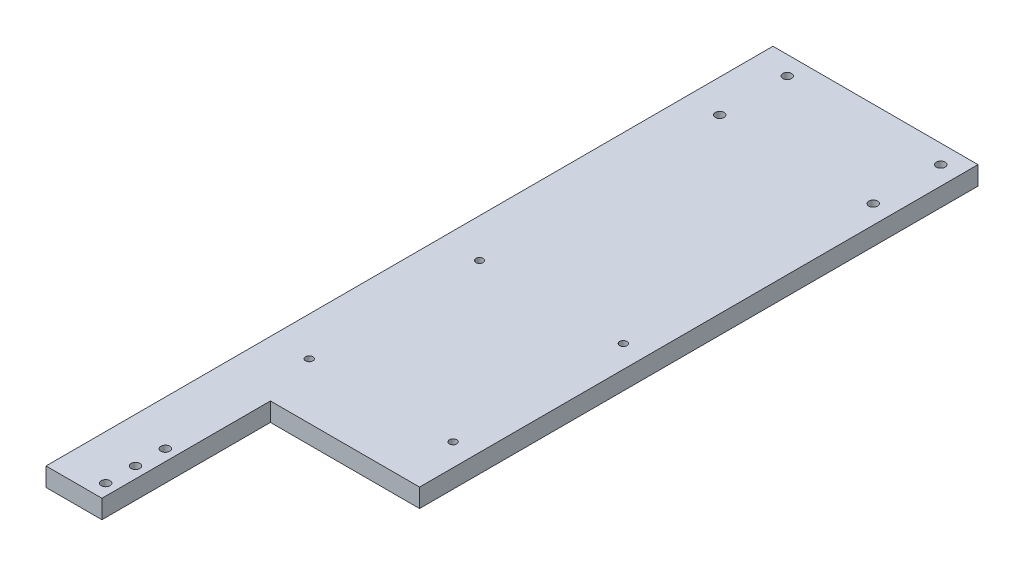
ISO-10303-21;
HEADER;
FILE_DESCRIPTION(('STEP AP214'),'2;1');
FILE_NAME('part.step','',(''),(''),'','','');
FILE_SCHEMA(('AUTOMOTIVE_DESIGN { 1 0 10303 214 1 1 1 1 }'));
ENDSEC;
DATA;
#1=APPLICATION_CONTEXT('core data for automotive mechanical design processes');
#2=APPLICATION_PROTOCOL_DEFINITION('international standard','automotive_design',2000,#1);
#3=PRODUCT_CONTEXT('',#1,'mechanical');
#4=PRODUCT('Part','Part','',(#3));
#5=PRODUCT_RELATED_PRODUCT_CATEGORY('part','',(#4));
#6=PRODUCT_DEFINITION_FORMATION('','',#4);
#7=PRODUCT_DEFINITION_CONTEXT('part definition',#1,'design');
#8=PRODUCT_DEFINITION('design','',#6,#7);
#9=PRODUCT_DEFINITION_SHAPE('','',#8);
#10=(LENGTH_UNIT() NAMED_UNIT(*) SI_UNIT(.MILLI.,.METRE.));
#11=(NAMED_UNIT(*) PLANE_ANGLE_UNIT() SI_UNIT($,.RADIAN.));
#12=(NAMED_UNIT(*) SI_UNIT($,.STERADIAN.) SOLID_ANGLE_UNIT());
#13=UNCERTAINTY_MEASURE_WITH_UNIT(LENGTH_MEASURE(1.E-05),#10,'distance_accuracy_value','');
#14=(GEOMETRIC_REPRESENTATION_CONTEXT(3) GLOBAL_UNCERTAINTY_ASSIGNED_CONTEXT((#13)) GLOBAL_UNIT_ASSIGNED_CONTEXT((#10,
#11,#12)) REPRESENTATION_CONTEXT('',''));
#15=CARTESIAN_POINT('',(0.,0.,0.));
#16=DIRECTION('',(0.,0.,1.));
#17=DIRECTION('',(1.,0.,0.));
#18=AXIS2_PLACEMENT_3D('',#15,#16,#17);
#19=CARTESIAN_POINT('',(0.,6.35,0.));
#20=DIRECTION('',(1.,0.,0.));
#21=DIRECTION('',(0.,0.,-1.));
#22=AXIS2_PLACEMENT_3D('',#19,#20,#21);
#23=PLANE('',#22);
#24=DIRECTION('',(0.,0.,1.));
#25=VECTOR('',#24,1.);
#26=CARTESIAN_POINT('',(0.,0.,0.));
#27=LINE('',#26,#25);
#28=CARTESIAN_POINT('',(0.,0.,-247.65));
#29=VERTEX_POINT('',#28);
#30=CARTESIAN_POINT('',(0.,0.,0.));
#31=VERTEX_POINT('',#30);
#32=EDGE_CURVE('E131',#29,#31,#27,.T.);
#33=ORIENTED_EDGE('',*,*,#32,.T.);
#34=DIRECTION('',(0.,-1.,0.));
#35=VECTOR('',#34,1.);
#36=CARTESIAN_POINT('',(0.,6.35,0.));
#37=LINE('',#36,#35);
#38=CARTESIAN_POINT('',(0.,6.35,0.));
#39=VERTEX_POINT('',#38);
#40=EDGE_CURVE('E11',#39,#31,#37,.T.);
#41=ORIENTED_EDGE('',*,*,#40,.F.);
#42=DIRECTION('',(0.,0.,1.));
#43=VECTOR('',#42,1.);
#44=CARTESIAN_POINT('',(0.,6.35,0.));
#45=LINE('',#44,#43);
#46=CARTESIAN_POINT('',(0.,6.35,-247.65));
#47=VERTEX_POINT('',#46);
#48=EDGE_CURVE('E128',#47,#39,#45,.T.);
#49=ORIENTED_EDGE('',*,*,#48,.F.);
#50=DIRECTION('',(0.,-1.,0.));
#51=VECTOR('',#50,1.);
#52=CARTESIAN_POINT('',(0.,6.35,-247.65));
#53=LINE('',#52,#51);
#54=EDGE_CURVE('E135',#47,#29,#53,.T.);
#55=ORIENTED_EDGE('',*,*,#54,.T.);
#56=EDGE_LOOP('',(#33,#41,#49,#55));
#57=FACE_BOUND('',#56,.T.);
#58=ADVANCED_FACE('F39',(#57),#23,.F.);
#59=CARTESIAN_POINT('',(0.,6.35,0.));
#60=DIRECTION('',(0.,0.,-1.));
#61=DIRECTION('',(-1.,0.,0.));
#62=AXIS2_PLACEMENT_3D('',#59,#60,#61);
#63=PLANE('',#62);
#64=DIRECTION('',(1.,0.,0.));
#65=VECTOR('',#64,1.);
#66=CARTESIAN_POINT('',(0.,0.,0.));
#67=LINE('',#66,#65);
#68=CARTESIAN_POINT('',(19.05,0.,0.));
#69=VERTEX_POINT('',#68);
#70=EDGE_CURVE('E124',#31,#69,#67,.T.);
#71=ORIENTED_EDGE('',*,*,#70,.T.);
#72=DIRECTION('',(0.,1.,0.));
#73=VECTOR('',#72,1.);
#74=CARTESIAN_POINT('',(19.05,0.,0.));
#75=LINE('',#74,#73);
#76=CARTESIAN_POINT('',(19.05,6.35,0.));
#77=VERTEX_POINT('',#76);
#78=EDGE_CURVE('E147',#69,#77,#75,.T.);
#79=ORIENTED_EDGE('',*,*,#78,.T.);
#80=DIRECTION('',(1.,0.,0.));
#81=VECTOR('',#80,1.);
#82=CARTESIAN_POINT('',(0.,6.35,0.));
#83=LINE('',#82,#81);
#84=EDGE_CURVE('E86',#39,#77,#83,.T.);
#85=ORIENTED_EDGE('',*,*,#84,.F.);
#86=ORIENTED_EDGE('',*,*,#40,.T.);
#87=EDGE_LOOP('',(#71,#79,#85,#86));
#88=FACE_BOUND('',#87,.T.);
#89=ADVANCED_FACE('F161',(#88),#63,.F.);
#90=CARTESIAN_POINT('',(69.85,6.35,0.));
#91=DIRECTION('',(-1.,0.,0.));
#92=DIRECTION('',(0.,0.,1.));
#93=AXIS2_PLACEMENT_3D('',#90,#91,#92);
#94=PLANE('',#93);
#95=DIRECTION('',(0.,0.,-1.));
#96=VECTOR('',#95,1.);
#97=CARTESIAN_POINT('',(69.85,6.35,0.));
#98=LINE('',#97,#96);
#99=CARTESIAN_POINT('',(69.85,6.35,-57.404));
#100=VERTEX_POINT('',#99);
#101=CARTESIAN_POINT('',(69.85,6.35,-247.65));
#102=VERTEX_POINT('',#101);
#103=EDGE_CURVE('E118',#100,#102,#98,.T.);
#104=ORIENTED_EDGE('',*,*,#103,.F.);
#105=DIRECTION('',(0.,1.,0.));
#106=VECTOR('',#105,1.);
#107=CARTESIAN_POINT('',(69.85,0.,-57.404));
#108=LINE('',#107,#106);
#109=CARTESIAN_POINT('',(69.85,0.,-57.404));
#110=VERTEX_POINT('',#109);
#111=EDGE_CURVE('E105',#110,#100,#108,.T.);
#112=ORIENTED_EDGE('',*,*,#111,.F.);
#113=DIRECTION('',(0.,0.,-1.));
#114=VECTOR('',#113,1.);
#115=CARTESIAN_POINT('',(69.85,0.,0.));
#116=LINE('',#115,#114);
#117=CARTESIAN_POINT('',(69.85,0.,-247.65));
#118=VERTEX_POINT('',#117);
#119=EDGE_CURVE('E117',#110,#118,#116,.T.);
#120=ORIENTED_EDGE('',*,*,#119,.T.);
#121=DIRECTION('',(0.,-1.,0.));
#122=VECTOR('',#121,1.);
#123=CARTESIAN_POINT('',(69.85,6.35,-247.65));
#124=LINE('',#123,#122);
#125=EDGE_CURVE('E47',#102,#118,#124,.T.);
#126=ORIENTED_EDGE('',*,*,#125,.F.);
#127=EDGE_LOOP('',(#104,#112,#120,#126));
#128=FACE_BOUND('',#127,.T.);
#129=ADVANCED_FACE('F115',(#128),#94,.F.);
#130=CARTESIAN_POINT('',(0.,6.35,-247.65));
#131=DIRECTION('',(0.,0.,1.));
#132=DIRECTION('',(1.,0.,0.));
#133=AXIS2_PLACEMENT_3D('',#130,#131,#132);
#134=PLANE('',#133);
#135=DIRECTION('',(-1.,0.,0.));
#136=VECTOR('',#135,1.);
#137=CARTESIAN_POINT('',(0.,0.,-247.65));
#138=LINE('',#137,#136);
#139=EDGE_CURVE('E80',#118,#29,#138,.T.);
#140=ORIENTED_EDGE('',*,*,#139,.T.);
#141=ORIENTED_EDGE('',*,*,#54,.F.);
#142=DIRECTION('',(-1.,0.,0.));
#143=VECTOR('',#142,1.);
#144=CARTESIAN_POINT('',(0.,6.35,-247.65));
#145=LINE('',#144,#143);
#146=EDGE_CURVE('E63',#102,#47,#145,.T.);
#147=ORIENTED_EDGE('',*,*,#146,.F.);
#148=ORIENTED_EDGE('',*,*,#125,.T.);
#149=EDGE_LOOP('',(#140,#141,#147,#148));
#150=FACE_BOUND('',#149,.T.);
#151=ADVANCED_FACE('F138',(#150),#134,.F.);
#152=CARTESIAN_POINT('',(0.,6.35,0.));
#153=DIRECTION('',(0.,-1.,0.));
#154=DIRECTION('',(0.,0.,-1.));
#155=AXIS2_PLACEMENT_3D('',#152,#153,#154);
#156=PLANE('',#155);
#157=CARTESIAN_POINT('',(13.23,6.35,-134.454));
#158=DIRECTION('',(0.,1.,0.));
#159=DIRECTION('',(0.,0.,1.));
#160=AXIS2_PLACEMENT_3D('',#157,#158,#159);
#161=CIRCLE('',#160,1.25);
#162=CARTESIAN_POINT('',(13.23,6.35,-133.204));
#163=VERTEX_POINT('',#162);
#164=EDGE_CURVE('E248',#163,#163,#161,.T.);
#165=ORIENTED_EDGE('',*,*,#164,.F.);
#166=EDGE_LOOP('',(#165));
#167=FACE_BOUND('',#166,.T.);
#168=CARTESIAN_POINT('',(62.23,6.35,-76.454));
#169=DIRECTION('',(0.,1.,0.));
#170=DIRECTION('',(0.,0.,1.));
#171=AXIS2_PLACEMENT_3D('',#168,#169,#170);
#172=CIRCLE('',#171,1.24999999999999);
#173=CARTESIAN_POINT('',(62.23,6.35,-75.204));
#174=VERTEX_POINT('',#173);
#175=EDGE_CURVE('E239',#174,#174,#172,.T.);
#176=ORIENTED_EDGE('',*,*,#175,.F.);
#177=EDGE_LOOP('',(#176));
#178=FACE_BOUND('',#177,.T.);
#179=CARTESIAN_POINT('',(13.23,6.35,-76.454));
#180=DIRECTION('',(0.,1.,0.));
#181=DIRECTION('',(0.,0.,1.));
#182=AXIS2_PLACEMENT_3D('',#179,#180,#181);
#183=CIRCLE('',#182,1.25);
#184=CARTESIAN_POINT('',(13.23,6.35,-75.204));
#185=VERTEX_POINT('',#184);
#186=EDGE_CURVE('E255',#185,#185,#183,.T.);
#187=ORIENTED_EDGE('',*,*,#186,.F.);
#188=EDGE_LOOP('',(#187));
#189=FACE_BOUND('',#188,.T.);
#190=CARTESIAN_POINT('',(62.23,6.35,-134.454));
#191=DIRECTION('',(0.,1.,0.));
#192=DIRECTION('',(0.,0.,1.));
#193=AXIS2_PLACEMENT_3D('',#190,#191,#192);
#194=CIRCLE('',#193,1.24999999999999);
#195=CARTESIAN_POINT('',(62.23,6.35,-133.204));
#196=VERTEX_POINT('',#195);
#197=EDGE_CURVE('E231',#196,#196,#194,.T.);
#198=ORIENTED_EDGE('',*,*,#197,.F.);
#199=EDGE_LOOP('',(#198));
#200=FACE_BOUND('',#199,.T.);
#201=CARTESIAN_POINT('',(11.2,6.35,-241.3));
#202=DIRECTION('',(0.,1.,0.));
#203=DIRECTION('',(0.,0.,1.));
#204=AXIS2_PLACEMENT_3D('',#201,#202,#203);
#205=CIRCLE('',#204,1.5);
#206=CARTESIAN_POINT('',(11.2,6.35,-239.8));
#207=VERTEX_POINT('',#206);
#208=EDGE_CURVE('E207',#207,#207,#205,.T.);
#209=ORIENTED_EDGE('',*,*,#208,.F.);
#210=EDGE_LOOP('',(#209));
#211=FACE_BOUND('',#210,.T.);
#212=CARTESIAN_POINT('',(11.2,6.35,-218.3));
#213=DIRECTION('',(0.,1.,0.));
#214=DIRECTION('',(0.,0.,1.));
#215=AXIS2_PLACEMENT_3D('',#212,#213,#214);
#216=CIRCLE('',#215,1.5);
#217=CARTESIAN_POINT('',(11.2,6.35,-216.8));
#218=VERTEX_POINT('',#217);
#219=EDGE_CURVE('E216',#218,#218,#216,.T.);
#220=ORIENTED_EDGE('',*,*,#219,.F.);
#221=EDGE_LOOP('',(#220));
#222=FACE_BOUND('',#221,.T.);
#223=CARTESIAN_POINT('',(63.5,6.35,-218.3));
#224=DIRECTION('',(0.,1.,0.));
#225=DIRECTION('',(0.,0.,1.));
#226=AXIS2_PLACEMENT_3D('',#223,#224,#225);
#227=CIRCLE('',#226,1.5);
#228=CARTESIAN_POINT('',(63.5,6.35,-216.8));
#229=VERTEX_POINT('',#228);
#230=EDGE_CURVE('E224',#229,#229,#227,.T.);
#231=ORIENTED_EDGE('',*,*,#230,.F.);
#232=EDGE_LOOP('',(#231));
#233=FACE_BOUND('',#232,.T.);
#234=CARTESIAN_POINT('',(63.5,6.35,-241.3));
#235=DIRECTION('',(0.,1.,0.));
#236=DIRECTION('',(0.,0.,1.));
#237=AXIS2_PLACEMENT_3D('',#234,#235,#236);
#238=CIRCLE('',#237,1.5);
#239=CARTESIAN_POINT('',(63.5,6.35,-239.8));
#240=VERTEX_POINT('',#239);
#241=EDGE_CURVE('E180',#240,#240,#238,.T.);
#242=ORIENTED_EDGE('',*,*,#241,.F.);
#243=EDGE_LOOP('',(#242));
#244=FACE_BOUND('',#243,.T.);
#245=CARTESIAN_POINT('',(15.24,6.35,-5.08));
#246=DIRECTION('',(0.,1.,0.));
#247=DIRECTION('',(0.,0.,1.));
#248=AXIS2_PLACEMENT_3D('',#245,#246,#247);
#249=CIRCLE('',#248,1.5);
#250=CARTESIAN_POINT('',(15.24,6.35,-3.58));
#251=VERTEX_POINT('',#250);
#252=EDGE_CURVE('E171',#251,#251,#249,.T.);
#253=ORIENTED_EDGE('',*,*,#252,.F.);
#254=EDGE_LOOP('',(#253));
#255=FACE_BOUND('',#254,.T.);
#256=CARTESIAN_POINT('',(15.24,6.35,-25.4));
#257=DIRECTION('',(0.,1.,0.));
#258=DIRECTION('',(0.,0.,1.));
#259=AXIS2_PLACEMENT_3D('',#256,#257,#258);
#260=CIRCLE('',#259,1.5);
#261=CARTESIAN_POINT('',(15.24,6.35,-23.9));
#262=VERTEX_POINT('',#261);
#263=EDGE_CURVE('E186',#262,#262,#260,.T.);
#264=ORIENTED_EDGE('',*,*,#263,.F.);
#265=EDGE_LOOP('',(#264));
#266=FACE_BOUND('',#265,.T.);
#267=CARTESIAN_POINT('',(15.24,6.35,-15.24));
#268=DIRECTION('',(0.,1.,0.));
#269=DIRECTION('',(0.,0.,1.));
#270=AXIS2_PLACEMENT_3D('',#267,#268,#269);
#271=CIRCLE('',#270,1.5);
#272=CARTESIAN_POINT('',(15.24,6.35,-13.74));
#273=VERTEX_POINT('',#272);
#274=EDGE_CURVE('E193',#273,#273,#271,.T.);
#275=ORIENTED_EDGE('',*,*,#274,.F.);
#276=EDGE_LOOP('',(#275));
#277=FACE_BOUND('',#276,.T.);
#278=ORIENTED_EDGE('',*,*,#84,.T.);
#279=DIRECTION('',(0.,0.,1.));
#280=VECTOR('',#279,1.);
#281=CARTESIAN_POINT('',(19.05,6.35,0.));
#282=LINE('',#281,#280);
#283=CARTESIAN_POINT('',(19.05,6.35,-57.404));
#284=VERTEX_POINT('',#283);
#285=EDGE_CURVE('E111',#284,#77,#282,.T.);
#286=ORIENTED_EDGE('',*,*,#285,.F.);
#287=DIRECTION('',(-1.,0.,0.));
#288=VECTOR('',#287,1.);
#289=CARTESIAN_POINT('',(69.85,6.35,-57.404));
#290=LINE('',#289,#288);
#291=EDGE_CURVE('E165',#100,#284,#290,.T.);
#292=ORIENTED_EDGE('',*,*,#291,.F.);
#293=ORIENTED_EDGE('',*,*,#103,.T.);
#294=ORIENTED_EDGE('',*,*,#146,.T.);
#295=ORIENTED_EDGE('',*,*,#48,.T.);
#296=EDGE_LOOP('',(#278,#286,#292,#293,#294,#295));
#297=FACE_BOUND('',#296,.T.);
#298=ADVANCED_FACE('F160',(#167,#178,#189,#200,#211,#222,#233,#244,#255,#266,#277,#297),#156,.F.);
#299=CARTESIAN_POINT('',(0.,0.,0.));
#300=DIRECTION('',(0.,-1.,0.));
#301=DIRECTION('',(0.,0.,-1.));
#302=AXIS2_PLACEMENT_3D('',#299,#300,#301);
#303=PLANE('',#302);
#304=CARTESIAN_POINT('',(13.23,0.,-134.454));
#305=DIRECTION('',(0.,1.,0.));
#306=DIRECTION('',(0.,0.,1.));
#307=AXIS2_PLACEMENT_3D('',#304,#305,#306);
#308=CIRCLE('',#307,1.25);
#309=CARTESIAN_POINT('',(13.23,0.,-133.204));
#310=VERTEX_POINT('',#309);
#311=EDGE_CURVE('E235',#310,#310,#308,.T.);
#312=ORIENTED_EDGE('',*,*,#311,.T.);
#313=EDGE_LOOP('',(#312));
#314=FACE_BOUND('',#313,.T.);
#315=CARTESIAN_POINT('',(62.23,0.,-76.454));
#316=DIRECTION('',(0.,1.,0.));
#317=DIRECTION('',(0.,0.,1.));
#318=AXIS2_PLACEMENT_3D('',#315,#316,#317);
#319=CIRCLE('',#318,1.24999999999999);
#320=CARTESIAN_POINT('',(62.23,0.,-75.204));
#321=VERTEX_POINT('',#320);
#322=EDGE_CURVE('E243',#321,#321,#319,.T.);
#323=ORIENTED_EDGE('',*,*,#322,.T.);
#324=EDGE_LOOP('',(#323));
#325=FACE_BOUND('',#324,.T.);
#326=CARTESIAN_POINT('',(13.23,0.,-76.454));
#327=DIRECTION('',(0.,1.,0.));
#328=DIRECTION('',(0.,0.,1.));
#329=AXIS2_PLACEMENT_3D('',#326,#327,#328);
#330=CIRCLE('',#329,1.25);
#331=CARTESIAN_POINT('',(13.23,0.,-75.204));
#332=VERTEX_POINT('',#331);
#333=EDGE_CURVE('E244',#332,#332,#330,.T.);
#334=ORIENTED_EDGE('',*,*,#333,.T.);
#335=EDGE_LOOP('',(#334));
#336=FACE_BOUND('',#335,.T.);
#337=CARTESIAN_POINT('',(62.23,0.,-134.454));
#338=DIRECTION('',(0.,1.,0.));
#339=DIRECTION('',(0.,0.,1.));
#340=AXIS2_PLACEMENT_3D('',#337,#338,#339);
#341=CIRCLE('',#340,1.24999999999999);
#342=CARTESIAN_POINT('',(62.23,0.,-133.204));
#343=VERTEX_POINT('',#342);
#344=EDGE_CURVE('E212',#343,#343,#341,.T.);
#345=ORIENTED_EDGE('',*,*,#344,.T.);
#346=EDGE_LOOP('',(#345));
#347=FACE_BOUND('',#346,.T.);
#348=CARTESIAN_POINT('',(11.2,0.,-241.3));
#349=DIRECTION('',(0.,1.,0.));
#350=DIRECTION('',(0.,0.,1.));
#351=AXIS2_PLACEMENT_3D('',#348,#349,#350);
#352=CIRCLE('',#351,1.5);
#353=CARTESIAN_POINT('',(11.2,0.,-239.8));
#354=VERTEX_POINT('',#353);
#355=EDGE_CURVE('E211',#354,#354,#352,.T.);
#356=ORIENTED_EDGE('',*,*,#355,.T.);
#357=EDGE_LOOP('',(#356));
#358=FACE_BOUND('',#357,.T.);
#359=CARTESIAN_POINT('',(11.2,0.,-218.3));
#360=DIRECTION('',(0.,1.,0.));
#361=DIRECTION('',(0.,0.,1.));
#362=AXIS2_PLACEMENT_3D('',#359,#360,#361);
#363=CIRCLE('',#362,1.5);
#364=CARTESIAN_POINT('',(11.2,0.,-216.8));
#365=VERTEX_POINT('',#364);
#366=EDGE_CURVE('E220',#365,#365,#363,.T.);
#367=ORIENTED_EDGE('',*,*,#366,.T.);
#368=EDGE_LOOP('',(#367));
#369=FACE_BOUND('',#368,.T.);
#370=CARTESIAN_POINT('',(63.5,0.,-218.3));
#371=DIRECTION('',(0.,1.,0.));
#372=DIRECTION('',(0.,0.,1.));
#373=AXIS2_PLACEMENT_3D('',#370,#371,#372);
#374=CIRCLE('',#373,1.5);
#375=CARTESIAN_POINT('',(63.5,0.,-216.8));
#376=VERTEX_POINT('',#375);
#377=EDGE_CURVE('E205',#376,#376,#374,.T.);
#378=ORIENTED_EDGE('',*,*,#377,.T.);
#379=EDGE_LOOP('',(#378));
#380=FACE_BOUND('',#379,.T.);
#381=CARTESIAN_POINT('',(63.5,0.,-241.3));
#382=DIRECTION('',(0.,1.,0.));
#383=DIRECTION('',(0.,0.,1.));
#384=AXIS2_PLACEMENT_3D('',#381,#382,#383);
#385=CIRCLE('',#384,1.5);
#386=CARTESIAN_POINT('',(63.5,0.,-239.8));
#387=VERTEX_POINT('',#386);
#388=EDGE_CURVE('E196',#387,#387,#385,.T.);
#389=ORIENTED_EDGE('',*,*,#388,.T.);
#390=EDGE_LOOP('',(#389));
#391=FACE_BOUND('',#390,.T.);
#392=CARTESIAN_POINT('',(15.24,0.,-5.08));
#393=DIRECTION('',(0.,1.,0.));
#394=DIRECTION('',(0.,0.,1.));
#395=AXIS2_PLACEMENT_3D('',#392,#393,#394);
#396=CIRCLE('',#395,1.5);
#397=CARTESIAN_POINT('',(15.24,0.,-3.58));
#398=VERTEX_POINT('',#397);
#399=EDGE_CURVE('E167',#398,#398,#396,.T.);
#400=ORIENTED_EDGE('',*,*,#399,.T.);
#401=EDGE_LOOP('',(#400));
#402=FACE_BOUND('',#401,.T.);
#403=CARTESIAN_POINT('',(15.24,0.,-25.4));
#404=DIRECTION('',(0.,1.,0.));
#405=DIRECTION('',(0.,0.,1.));
#406=AXIS2_PLACEMENT_3D('',#403,#404,#405);
#407=CIRCLE('',#406,1.5);
#408=CARTESIAN_POINT('',(15.24,0.,-23.9));
#409=VERTEX_POINT('',#408);
#410=EDGE_CURVE('E177',#409,#409,#407,.T.);
#411=ORIENTED_EDGE('',*,*,#410,.T.);
#412=EDGE_LOOP('',(#411));
#413=FACE_BOUND('',#412,.T.);
#414=CARTESIAN_POINT('',(15.24,0.,-15.24));
#415=DIRECTION('',(0.,1.,0.));
#416=DIRECTION('',(0.,0.,1.));
#417=AXIS2_PLACEMENT_3D('',#414,#415,#416);
#418=CIRCLE('',#417,1.5);
#419=CARTESIAN_POINT('',(15.24,0.,-13.74));
#420=VERTEX_POINT('',#419);
#421=EDGE_CURVE('E190',#420,#420,#418,.T.);
#422=ORIENTED_EDGE('',*,*,#421,.T.);
#423=EDGE_LOOP('',(#422));
#424=FACE_BOUND('',#423,.T.);
#425=DIRECTION('',(0.,0.,1.));
#426=VECTOR('',#425,1.);
#427=CARTESIAN_POINT('',(19.05,0.,0.));
#428=LINE('',#427,#426);
#429=CARTESIAN_POINT('',(19.05,0.,-57.404));
#430=VERTEX_POINT('',#429);
#431=EDGE_CURVE('E54',#430,#69,#428,.T.);
#432=ORIENTED_EDGE('',*,*,#431,.T.);
#433=ORIENTED_EDGE('',*,*,#70,.F.);
#434=ORIENTED_EDGE('',*,*,#32,.F.);
#435=ORIENTED_EDGE('',*,*,#139,.F.);
#436=ORIENTED_EDGE('',*,*,#119,.F.);
#437=DIRECTION('',(-1.,0.,0.));
#438=VECTOR('',#437,1.);
#439=CARTESIAN_POINT('',(69.85,0.,-57.404));
#440=LINE('',#439,#438);
#441=EDGE_CURVE('E101',#110,#430,#440,.T.);
#442=ORIENTED_EDGE('',*,*,#441,.T.);
#443=EDGE_LOOP('',(#432,#433,#434,#435,#436,#442));
#444=FACE_BOUND('',#443,.T.);
#445=ADVANCED_FACE('F121',(#314,#325,#336,#347,#358,#369,#380,#391,#402,#413,#424,#444),#303,.T.);
#446=CARTESIAN_POINT('',(19.05,0.,0.));
#447=DIRECTION('',(-1.,0.,0.));
#448=DIRECTION('',(0.,0.,1.));
#449=AXIS2_PLACEMENT_3D('',#446,#447,#448);
#450=PLANE('',#449);
#451=ORIENTED_EDGE('',*,*,#285,.T.);
#452=ORIENTED_EDGE('',*,*,#78,.F.);
#453=ORIENTED_EDGE('',*,*,#431,.F.);
#454=DIRECTION('',(0.,1.,0.));
#455=VECTOR('',#454,1.);
#456=CARTESIAN_POINT('',(19.05,0.,-57.404));
#457=LINE('',#456,#455);
#458=EDGE_CURVE('E107',#430,#284,#457,.T.);
#459=ORIENTED_EDGE('',*,*,#458,.T.);
#460=EDGE_LOOP('',(#451,#452,#453,#459));
#461=FACE_BOUND('',#460,.T.);
#462=ADVANCED_FACE('F320',(#461),#450,.F.);
#463=CARTESIAN_POINT('',(69.85,0.,-57.404));
#464=DIRECTION('',(0.,0.,-1.));
#465=DIRECTION('',(-1.,0.,0.));
#466=AXIS2_PLACEMENT_3D('',#463,#464,#465);
#467=PLANE('',#466);
#468=ORIENTED_EDGE('',*,*,#291,.T.);
#469=ORIENTED_EDGE('',*,*,#458,.F.);
#470=ORIENTED_EDGE('',*,*,#441,.F.);
#471=ORIENTED_EDGE('',*,*,#111,.T.);
#472=EDGE_LOOP('',(#468,#469,#470,#471));
#473=FACE_BOUND('',#472,.T.);
#474=ADVANCED_FACE('F104',(#473),#467,.F.);
#475=CARTESIAN_POINT('',(15.24,0.,-15.24));
#476=DIRECTION('',(0.,1.,0.));
#477=DIRECTION('',(0.,0.,1.));
#478=AXIS2_PLACEMENT_3D('',#475,#476,#477);
#479=CYLINDRICAL_SURFACE('',#478,1.5);
#480=ORIENTED_EDGE('',*,*,#421,.F.);
#481=EDGE_LOOP('',(#480));
#482=FACE_BOUND('',#481,.T.);
#483=ORIENTED_EDGE('',*,*,#274,.T.);
#484=EDGE_LOOP('',(#483));
#485=FACE_BOUND('',#484,.T.);
#486=ADVANCED_FACE('F295',(#482,#485),#479,.F.);
#487=CARTESIAN_POINT('',(15.24,0.,-25.4));
#488=DIRECTION('',(0.,1.,0.));
#489=DIRECTION('',(0.,0.,1.));
#490=AXIS2_PLACEMENT_3D('',#487,#488,#489);
#491=CYLINDRICAL_SURFACE('',#490,1.5);
#492=ORIENTED_EDGE('',*,*,#410,.F.);
#493=EDGE_LOOP('',(#492));
#494=FACE_BOUND('',#493,.T.);
#495=ORIENTED_EDGE('',*,*,#263,.T.);
#496=EDGE_LOOP('',(#495));
#497=FACE_BOUND('',#496,.T.);
#498=ADVANCED_FACE('F292',(#494,#497),#491,.F.);
#499=CARTESIAN_POINT('',(15.24,0.,-5.08));
#500=DIRECTION('',(0.,1.,0.));
#501=DIRECTION('',(0.,0.,1.));
#502=AXIS2_PLACEMENT_3D('',#499,#500,#501);
#503=CYLINDRICAL_SURFACE('',#502,1.5);
#504=ORIENTED_EDGE('',*,*,#399,.F.);
#505=EDGE_LOOP('',(#504));
#506=FACE_BOUND('',#505,.T.);
#507=ORIENTED_EDGE('',*,*,#252,.T.);
#508=EDGE_LOOP('',(#507));
#509=FACE_BOUND('',#508,.T.);
#510=ADVANCED_FACE('F294',(#506,#509),#503,.F.);
#511=CARTESIAN_POINT('',(63.5,0.,-241.3));
#512=DIRECTION('',(0.,1.,0.));
#513=DIRECTION('',(0.,0.,1.));
#514=AXIS2_PLACEMENT_3D('',#511,#512,#513);
#515=CYLINDRICAL_SURFACE('',#514,1.5);
#516=ORIENTED_EDGE('',*,*,#388,.F.);
#517=EDGE_LOOP('',(#516));
#518=FACE_BOUND('',#517,.T.);
#519=ORIENTED_EDGE('',*,*,#241,.T.);
#520=EDGE_LOOP('',(#519));
#521=FACE_BOUND('',#520,.T.);
#522=ADVANCED_FACE('F302',(#518,#521),#515,.F.);
#523=CARTESIAN_POINT('',(63.5,0.,-218.3));
#524=DIRECTION('',(0.,1.,0.));
#525=DIRECTION('',(0.,0.,1.));
#526=AXIS2_PLACEMENT_3D('',#523,#524,#525);
#527=CYLINDRICAL_SURFACE('',#526,1.5);
#528=ORIENTED_EDGE('',*,*,#377,.F.);
#529=EDGE_LOOP('',(#528));
#530=FACE_BOUND('',#529,.T.);
#531=ORIENTED_EDGE('',*,*,#230,.T.);
#532=EDGE_LOOP('',(#531));
#533=FACE_BOUND('',#532,.T.);
#534=ADVANCED_FACE('F358',(#530,#533),#527,.F.);
#535=CARTESIAN_POINT('',(11.2,0.,-218.3));
#536=DIRECTION('',(0.,1.,0.));
#537=DIRECTION('',(0.,0.,1.));
#538=AXIS2_PLACEMENT_3D('',#535,#536,#537);
#539=CYLINDRICAL_SURFACE('',#538,1.5);
#540=ORIENTED_EDGE('',*,*,#366,.F.);
#541=EDGE_LOOP('',(#540));
#542=FACE_BOUND('',#541,.T.);
#543=ORIENTED_EDGE('',*,*,#219,.T.);
#544=EDGE_LOOP('',(#543));
#545=FACE_BOUND('',#544,.T.);
#546=ADVANCED_FACE('F368',(#542,#545),#539,.F.);
#547=CARTESIAN_POINT('',(11.2,0.,-241.3));
#548=DIRECTION('',(0.,1.,0.));
#549=DIRECTION('',(0.,0.,1.));
#550=AXIS2_PLACEMENT_3D('',#547,#548,#549);
#551=CYLINDRICAL_SURFACE('',#550,1.5);
#552=ORIENTED_EDGE('',*,*,#355,.F.);
#553=EDGE_LOOP('',(#552));
#554=FACE_BOUND('',#553,.T.);
#555=ORIENTED_EDGE('',*,*,#208,.T.);
#556=EDGE_LOOP('',(#555));
#557=FACE_BOUND('',#556,.T.);
#558=ADVANCED_FACE('F378',(#554,#557),#551,.F.);
#559=CARTESIAN_POINT('',(62.23,0.,-134.454));
#560=DIRECTION('',(0.,1.,0.));
#561=DIRECTION('',(0.,0.,1.));
#562=AXIS2_PLACEMENT_3D('',#559,#560,#561);
#563=CYLINDRICAL_SURFACE('',#562,1.24999999999999);
#564=ORIENTED_EDGE('',*,*,#344,.F.);
#565=EDGE_LOOP('',(#564));
#566=FACE_BOUND('',#565,.T.);
#567=ORIENTED_EDGE('',*,*,#197,.T.);
#568=EDGE_LOOP('',(#567));
#569=FACE_BOUND('',#568,.T.);
#570=ADVANCED_FACE('F269',(#566,#569),#563,.F.);
#571=CARTESIAN_POINT('',(13.23,0.,-76.454));
#572=DIRECTION('',(0.,1.,0.));
#573=DIRECTION('',(0.,0.,1.));
#574=AXIS2_PLACEMENT_3D('',#571,#572,#573);
#575=CYLINDRICAL_SURFACE('',#574,1.25);
#576=ORIENTED_EDGE('',*,*,#333,.F.);
#577=EDGE_LOOP('',(#576));
#578=FACE_BOUND('',#577,.T.);
#579=ORIENTED_EDGE('',*,*,#186,.T.);
#580=EDGE_LOOP('',(#579));
#581=FACE_BOUND('',#580,.T.);
#582=ADVANCED_FACE('F265',(#578,#581),#575,.F.);
#583=CARTESIAN_POINT('',(62.23,0.,-76.454));
#584=DIRECTION('',(0.,1.,0.));
#585=DIRECTION('',(0.,0.,1.));
#586=AXIS2_PLACEMENT_3D('',#583,#584,#585);
#587=CYLINDRICAL_SURFACE('',#586,1.24999999999999);
#588=ORIENTED_EDGE('',*,*,#322,.F.);
#589=EDGE_LOOP('',(#588));
#590=FACE_BOUND('',#589,.T.);
#591=ORIENTED_EDGE('',*,*,#175,.T.);
#592=EDGE_LOOP('',(#591));
#593=FACE_BOUND('',#592,.T.);
#594=ADVANCED_FACE('F268',(#590,#593),#587,.F.);
#595=CARTESIAN_POINT('',(13.23,0.,-134.454));
#596=DIRECTION('',(0.,1.,0.));
#597=DIRECTION('',(0.,0.,1.));
#598=AXIS2_PLACEMENT_3D('',#595,#596,#597);
#599=CYLINDRICAL_SURFACE('',#598,1.25);
#600=ORIENTED_EDGE('',*,*,#311,.F.);
#601=EDGE_LOOP('',(#600));
#602=FACE_BOUND('',#601,.T.);
#603=ORIENTED_EDGE('',*,*,#164,.T.);
#604=EDGE_LOOP('',(#603));
#605=FACE_BOUND('',#604,.T.);
#606=ADVANCED_FACE('F423',(#602,#605),#599,.F.);
#607=CLOSED_SHELL('',(#58,#89,#129,#151,#298,#445,#462,#474,#486,#498,#510,#522,#534,#546,#558,
#570,#582,#594,#606));
#608=MANIFOLD_SOLID_BREP('B2',#607);
#609=ADVANCED_BREP_SHAPE_REPRESENTATION('',(#18,#608),#14);
#610=SHAPE_DEFINITION_REPRESENTATION(#9,#609);
ENDSEC;
END-ISO-10303-21;
